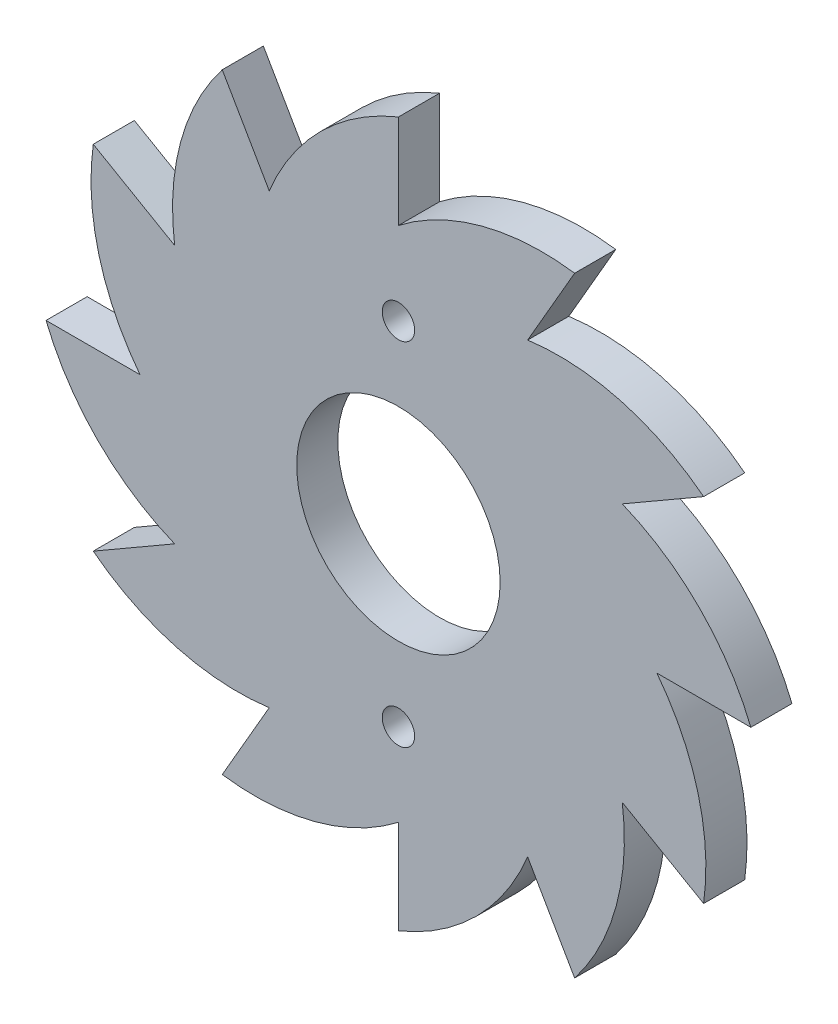
ISO-10303-21;
HEADER;
FILE_DESCRIPTION(('STEP AP214'),'2;1');
FILE_NAME('part.step','',(''),(''),'','','');
FILE_SCHEMA(('AUTOMOTIVE_DESIGN { 1 0 10303 214 1 1 1 1 }'));
ENDSEC;
DATA;
#1=APPLICATION_CONTEXT('core data for automotive mechanical design processes');
#2=APPLICATION_PROTOCOL_DEFINITION('international standard','automotive_design',2000,#1);
#3=PRODUCT_CONTEXT('',#1,'mechanical');
#4=PRODUCT('Part','Part','',(#3));
#5=PRODUCT_RELATED_PRODUCT_CATEGORY('part','',(#4));
#6=PRODUCT_DEFINITION_FORMATION('','',#4);
#7=PRODUCT_DEFINITION_CONTEXT('part definition',#1,'design');
#8=PRODUCT_DEFINITION('design','',#6,#7);
#9=PRODUCT_DEFINITION_SHAPE('','',#8);
#10=(LENGTH_UNIT() NAMED_UNIT(*) SI_UNIT(.MILLI.,.METRE.));
#11=(NAMED_UNIT(*) PLANE_ANGLE_UNIT() SI_UNIT($,.RADIAN.));
#12=(NAMED_UNIT(*) SI_UNIT($,.STERADIAN.) SOLID_ANGLE_UNIT());
#13=UNCERTAINTY_MEASURE_WITH_UNIT(LENGTH_MEASURE(1.E-05),#10,'distance_accuracy_value','');
#14=(GEOMETRIC_REPRESENTATION_CONTEXT(3) GLOBAL_UNCERTAINTY_ASSIGNED_CONTEXT((#13)) GLOBAL_UNIT_ASSIGNED_CONTEXT((#10,
#11,#12)) REPRESENTATION_CONTEXT('',''));
#15=CARTESIAN_POINT('',(0.,0.,0.));
#16=DIRECTION('',(0.,0.,1.));
#17=DIRECTION('',(1.,0.,0.));
#18=AXIS2_PLACEMENT_3D('',#15,#16,#17);
#19=CARTESIAN_POINT('',(0.,0.,4.445));
#20=DIRECTION('',(0.,0.,1.));
#21=DIRECTION('',(1.,0.,0.));
#22=AXIS2_PLACEMENT_3D('',#19,#20,#21);
#23=PLANE('',#22);
#24=CARTESIAN_POINT('',(0.,0.,4.445));
#25=DIRECTION('',(0.,0.,1.));
#26=DIRECTION('',(1.,0.,0.));
#27=AXIS2_PLACEMENT_3D('',#24,#25,#26);
#28=CIRCLE('',#27,10.9982);
#29=CARTESIAN_POINT('',(10.9982,0.,4.445));
#30=VERTEX_POINT('',#29);
#31=EDGE_CURVE('E240',#30,#30,#28,.T.);
#32=ORIENTED_EDGE('',*,*,#31,.F.);
#33=EDGE_LOOP('',(#32));
#34=FACE_BOUND('',#33,.T.);
#35=CARTESIAN_POINT('',(0.,18.9992,4.445));
#36=DIRECTION('',(0.,0.,1.));
#37=DIRECTION('',(1.,0.,0.));
#38=AXIS2_PLACEMENT_3D('',#35,#36,#37);
#39=CIRCLE('',#38,1.7526);
#40=CARTESIAN_POINT('',(1.7526,18.9992,4.445));
#41=VERTEX_POINT('',#40);
#42=EDGE_CURVE('E11',#41,#41,#39,.T.);
#43=ORIENTED_EDGE('',*,*,#42,.F.);
#44=EDGE_LOOP('',(#43));
#45=FACE_BOUND('',#44,.T.);
#46=CARTESIAN_POINT('',(0.,-18.9992,4.445));
#47=DIRECTION('',(0.,0.,1.));
#48=DIRECTION('',(1.,0.,0.));
#49=AXIS2_PLACEMENT_3D('',#46,#47,#48);
#50=CIRCLE('',#49,1.7526);
#51=CARTESIAN_POINT('',(1.7526,-18.9992,4.445));
#52=VERTEX_POINT('',#51);
#53=EDGE_CURVE('E234',#52,#52,#50,.T.);
#54=ORIENTED_EDGE('',*,*,#53,.F.);
#55=EDGE_LOOP('',(#54));
#56=FACE_BOUND('',#55,.T.);
#57=CARTESIAN_POINT('',(15.5298763611878,7.84067314047041,4.445));
#58=DIRECTION('',(0.,0.,1.));
#59=DIRECTION('',(0.866025403784445,-0.499999999999989,0.));
#60=AXIS2_PLACEMENT_3D('',#57,#58,#59);
#61=CIRCLE('',#60,25.4);
#62=CARTESIAN_POINT('',(-4.00721122950642E-13,27.94,4.445));
#63=VERTEX_POINT('',#62);
#64=CARTESIAN_POINT('',(19.0499999999996,32.9955678841874,4.445));
#65=VERTEX_POINT('',#64);
#66=EDGE_CURVE('E218',#63,#65,#61,.F.);
#67=ORIENTED_EDGE('',*,*,#66,.F.);
#68=DIRECTION('',(0.,1.,0.));
#69=VECTOR('',#68,1.);
#70=CARTESIAN_POINT('',(0.,0.,4.445));
#71=LINE('',#70,#69);
#72=CARTESIAN_POINT('',(-5.51642065360625E-13,38.1,4.445));
#73=VERTEX_POINT('',#72);
#74=EDGE_CURVE('E207',#63,#73,#71,.T.);
#75=ORIENTED_EDGE('',*,*,#74,.T.);
#76=CARTESIAN_POINT('',(9.52893087618506,14.5551603030115,4.445));
#77=DIRECTION('',(0.,0.,1.));
#78=DIRECTION('',(1.,0.,0.));
#79=AXIS2_PLACEMENT_3D('',#76,#77,#78);
#80=CIRCLE('',#79,25.4);
#81=CARTESIAN_POINT('',(-13.97,24.1967497817372,4.445));
#82=VERTEX_POINT('',#81);
#83=EDGE_CURVE('E216',#82,#73,#80,.F.);
#84=ORIENTED_EDGE('',*,*,#83,.F.);
#85=DIRECTION('',(-0.500000000000001,0.866025403784438,0.));
#86=VECTOR('',#85,1.);
#87=CARTESIAN_POINT('',(0.,0.,4.445));
#88=LINE('',#87,#86);
#89=CARTESIAN_POINT('',(-19.0500000000001,32.9955678841871,4.445));
#90=VERTEX_POINT('',#89);
#91=EDGE_CURVE('E223',#82,#90,#88,.T.);
#92=ORIENTED_EDGE('',*,*,#91,.T.);
#93=CARTESIAN_POINT('',(0.974716058176415,17.3696040166553,4.445));
#94=DIRECTION('',(0.,0.,1.));
#95=DIRECTION('',(0.866025403784438,0.500000000000001,0.));
#96=AXIS2_PLACEMENT_3D('',#93,#94,#95);
#97=CIRCLE('',#96,25.4);
#98=CARTESIAN_POINT('',(-24.1967497817373,13.9699999999999,4.445));
#99=VERTEX_POINT('',#98);
#100=EDGE_CURVE('E432',#99,#90,#97,.F.);
#101=ORIENTED_EDGE('',*,*,#100,.F.);
#102=DIRECTION('',(-0.86602540378444,0.499999999999998,0.));
#103=VECTOR('',#102,1.);
#104=CARTESIAN_POINT('',(0.,0.,4.445));
#105=LINE('',#104,#103);
#106=CARTESIAN_POINT('',(-32.9955678841872,19.0499999999999,4.445));
#107=VERTEX_POINT('',#106);
#108=EDGE_CURVE('E421',#99,#107,#105,.T.);
#109=ORIENTED_EDGE('',*,*,#108,.T.);
#110=CARTESIAN_POINT('',(-7.84067314047025,15.5298763611879,4.445));
#111=DIRECTION('',(0.,0.,1.));
#112=DIRECTION('',(0.499999999999998,0.86602540378444,0.));
#113=AXIS2_PLACEMENT_3D('',#110,#111,#112);
#114=CIRCLE('',#113,25.4);
#115=CARTESIAN_POINT('',(-27.94,-1.07552855510562E-13,4.445));
#116=VERTEX_POINT('',#115);
#117=EDGE_CURVE('E419',#116,#107,#114,.F.);
#118=ORIENTED_EDGE('',*,*,#117,.F.);
#119=DIRECTION('',(-1.,0.,0.));
#120=VECTOR('',#119,1.);
#121=CARTESIAN_POINT('',(0.,0.,4.445));
#122=LINE('',#121,#120);
#123=CARTESIAN_POINT('',(-38.1,-1.49186218934005E-13,4.445));
#124=VERTEX_POINT('',#123);
#125=EDGE_CURVE('E406',#116,#124,#122,.T.);
#126=ORIENTED_EDGE('',*,*,#125,.T.);
#127=CARTESIAN_POINT('',(-14.5551603030115,9.52893087618501,4.445));
#128=DIRECTION('',(0.,0.,1.));
#129=DIRECTION('',(0.,1.,0.));
#130=AXIS2_PLACEMENT_3D('',#127,#128,#129);
#131=CIRCLE('',#130,25.4);
#132=CARTESIAN_POINT('',(-24.1967497817372,-13.9700000000001,4.445));
#133=VERTEX_POINT('',#132);
#134=EDGE_CURVE('E404',#133,#124,#131,.F.);
#135=ORIENTED_EDGE('',*,*,#134,.F.);
#136=DIRECTION('',(-0.866025403784436,-0.500000000000004,0.));
#137=VECTOR('',#136,1.);
#138=CARTESIAN_POINT('',(0.,0.,4.445));
#139=LINE('',#138,#137);
#140=CARTESIAN_POINT('',(-32.995567884187,-19.0500000000002,4.445));
#141=VERTEX_POINT('',#140);
#142=EDGE_CURVE('E390',#133,#141,#139,.T.);
#143=ORIENTED_EDGE('',*,*,#142,.T.);
#144=CARTESIAN_POINT('',(-17.3696040166553,0.974716058176354,4.445));
#145=DIRECTION('',(0.,0.,1.));
#146=DIRECTION('',(-0.500000000000004,0.866025403784436,0.));
#147=AXIS2_PLACEMENT_3D('',#144,#145,#146);
#148=CIRCLE('',#147,25.4);
#149=CARTESIAN_POINT('',(-13.9699999999999,-24.1967497817373,4.445));
#150=VERTEX_POINT('',#149);
#151=EDGE_CURVE('E388',#150,#141,#148,.F.);
#152=ORIENTED_EDGE('',*,*,#151,.F.);
#153=DIRECTION('',(-0.499999999999995,-0.866025403784442,0.));
#154=VECTOR('',#153,1.);
#155=CARTESIAN_POINT('',(0.,0.,4.445));
#156=LINE('',#155,#154);
#157=CARTESIAN_POINT('',(-19.0499999999998,-32.9955678841872,4.445));
#158=VERTEX_POINT('',#157);
#159=EDGE_CURVE('E374',#150,#158,#156,.T.);
#160=ORIENTED_EDGE('',*,*,#159,.T.);
#161=CARTESIAN_POINT('',(-15.5298763611879,-7.8406731404703,4.445));
#162=DIRECTION('',(0.,0.,1.));
#163=DIRECTION('',(-0.866025403784442,0.499999999999995,0.));
#164=AXIS2_PLACEMENT_3D('',#161,#162,#163);
#165=CIRCLE('',#164,25.4);
#166=CARTESIAN_POINT('',(2.04697370165263E-13,-27.94,4.445));
#167=VERTEX_POINT('',#166);
#168=EDGE_CURVE('E372',#167,#158,#165,.F.);
#169=ORIENTED_EDGE('',*,*,#168,.F.);
#170=DIRECTION('',(0.,-1.,0.));
#171=VECTOR('',#170,1.);
#172=CARTESIAN_POINT('',(0.,0.,4.445));
#173=LINE('',#172,#171);
#174=CARTESIAN_POINT('',(2.84494650060196E-13,-38.1,4.445));
#175=VERTEX_POINT('',#174);
#176=EDGE_CURVE('E358',#167,#175,#173,.T.);
#177=ORIENTED_EDGE('',*,*,#176,.T.);
#178=CARTESIAN_POINT('',(-9.52893087618506,-14.5551603030115,4.445));
#179=DIRECTION('',(0.,0.,1.));
#180=DIRECTION('',(-1.,0.,0.));
#181=AXIS2_PLACEMENT_3D('',#178,#179,#180);
#182=CIRCLE('',#181,25.4);
#183=CARTESIAN_POINT('',(13.97,-24.1967497817372,4.445));
#184=VERTEX_POINT('',#183);
#185=EDGE_CURVE('E356',#184,#175,#182,.F.);
#186=ORIENTED_EDGE('',*,*,#185,.F.);
#187=DIRECTION('',(0.500000000000001,-0.866025403784438,0.));
#188=VECTOR('',#187,1.);
#189=CARTESIAN_POINT('',(0.,0.,4.445));
#190=LINE('',#189,#188);
#191=CARTESIAN_POINT('',(19.0500000000001,-32.9955678841871,4.445));
#192=VERTEX_POINT('',#191);
#193=EDGE_CURVE('E342',#184,#192,#190,.T.);
#194=ORIENTED_EDGE('',*,*,#193,.T.);
#195=CARTESIAN_POINT('',(-0.974716058176293,-17.3696040166553,4.445));
#196=DIRECTION('',(0.,0.,1.));
#197=DIRECTION('',(-0.866025403784435,-0.500000000000007,0.));
#198=AXIS2_PLACEMENT_3D('',#195,#196,#197);
#199=CIRCLE('',#198,25.4);
#200=CARTESIAN_POINT('',(24.1967497817374,-13.9699999999998,4.445));
#201=VERTEX_POINT('',#200);
#202=EDGE_CURVE('E340',#201,#192,#199,.F.);
#203=ORIENTED_EDGE('',*,*,#202,.F.);
#204=DIRECTION('',(0.866025403784444,-0.499999999999992,0.));
#205=VECTOR('',#204,1.);
#206=CARTESIAN_POINT('',(0.,0.,4.445));
#207=LINE('',#206,#205);
#208=CARTESIAN_POINT('',(32.9955678841873,-19.0499999999997,4.445));
#209=VERTEX_POINT('',#208);
#210=EDGE_CURVE('E326',#201,#209,#207,.T.);
#211=ORIENTED_EDGE('',*,*,#210,.T.);
#212=CARTESIAN_POINT('',(7.84067314047035,-15.5298763611878,4.445));
#213=DIRECTION('',(0.,0.,1.));
#214=DIRECTION('',(-0.499999999999992,-0.866025403784443,0.));
#215=AXIS2_PLACEMENT_3D('',#212,#213,#214);
#216=CIRCLE('',#215,25.4);
#217=CARTESIAN_POINT('',(27.94,3.01841884819964E-13,4.445));
#218=VERTEX_POINT('',#217);
#219=EDGE_CURVE('E324',#218,#209,#216,.F.);
#220=ORIENTED_EDGE('',*,*,#219,.F.);
#221=DIRECTION('',(1.,0.,0.));
#222=VECTOR('',#221,1.);
#223=CARTESIAN_POINT('',(0.,0.,4.445));
#224=LINE('',#223,#222);
#225=CARTESIAN_POINT('',(38.1,4.16333634234434E-13,4.445));
#226=VERTEX_POINT('',#225);
#227=EDGE_CURVE('E310',#218,#226,#224,.T.);
#228=ORIENTED_EDGE('',*,*,#227,.T.);
#229=CARTESIAN_POINT('',(14.5551603030116,-9.5289308761849,4.445));
#230=DIRECTION('',(0.,0.,1.));
#231=DIRECTION('',(0.,-1.,0.));
#232=AXIS2_PLACEMENT_3D('',#229,#230,#231);
#233=CIRCLE('',#232,25.4);
#234=CARTESIAN_POINT('',(24.1967497817371,13.9700000000003,4.445));
#235=VERTEX_POINT('',#234);
#236=EDGE_CURVE('E308',#235,#226,#233,.F.);
#237=ORIENTED_EDGE('',*,*,#236,.F.);
#238=DIRECTION('',(0.866025403784433,0.500000000000011,0.));
#239=VECTOR('',#238,1.);
#240=CARTESIAN_POINT('',(0.,0.,4.445));
#241=LINE('',#240,#239);
#242=CARTESIAN_POINT('',(32.9955678841869,19.0500000000004,4.445));
#243=VERTEX_POINT('',#242);
#244=EDGE_CURVE('E296',#235,#243,#241,.T.);
#245=ORIENTED_EDGE('',*,*,#244,.T.);
#246=CARTESIAN_POINT('',(17.3696040166553,-0.974716058176232,4.445));
#247=DIRECTION('',(0.,0.,1.));
#248=DIRECTION('',(0.50000000000001,-0.866025403784433,0.));
#249=AXIS2_PLACEMENT_3D('',#246,#247,#248);
#250=CIRCLE('',#249,25.4);
#251=CARTESIAN_POINT('',(13.9699999999997,24.1967497817374,4.445));
#252=VERTEX_POINT('',#251);
#253=EDGE_CURVE('E294',#252,#243,#250,.F.);
#254=ORIENTED_EDGE('',*,*,#253,.F.);
#255=DIRECTION('',(0.499999999999989,0.866025403784445,0.));
#256=VECTOR('',#255,1.);
#257=CARTESIAN_POINT('',(0.,0.,4.445));
#258=LINE('',#257,#256);
#259=EDGE_CURVE('E284',#252,#65,#258,.T.);
#260=ORIENTED_EDGE('',*,*,#259,.T.);
#261=EDGE_LOOP('',(#67,#75,#84,#92,#101,#109,#118,#126,#135,#143,#152,#160,#169,#177,#186,#194,
#203,#211,#220,#228,#237,#245,#254,#260));
#262=FACE_BOUND('',#261,.T.);
#263=ADVANCED_FACE('F32',(#34,#45,#56,#262),#23,.T.);
#264=CARTESIAN_POINT('',(0.,0.,0.));
#265=DIRECTION('',(0.,0.,1.));
#266=DIRECTION('',(1.,0.,0.));
#267=AXIS2_PLACEMENT_3D('',#264,#265,#266);
#268=PLANE('',#267);
#269=CARTESIAN_POINT('',(0.,0.,0.));
#270=DIRECTION('',(0.,0.,1.));
#271=DIRECTION('',(1.,0.,0.));
#272=AXIS2_PLACEMENT_3D('',#269,#270,#271);
#273=CIRCLE('',#272,10.9982);
#274=CARTESIAN_POINT('',(10.9982,0.,0.));
#275=VERTEX_POINT('',#274);
#276=EDGE_CURVE('E237',#275,#275,#273,.T.);
#277=ORIENTED_EDGE('',*,*,#276,.T.);
#278=EDGE_LOOP('',(#277));
#279=FACE_BOUND('',#278,.T.);
#280=CARTESIAN_POINT('',(0.,18.9992,0.));
#281=DIRECTION('',(0.,0.,1.));
#282=DIRECTION('',(1.,0.,0.));
#283=AXIS2_PLACEMENT_3D('',#280,#281,#282);
#284=CIRCLE('',#283,1.7526);
#285=CARTESIAN_POINT('',(1.7526,18.9992,0.));
#286=VERTEX_POINT('',#285);
#287=EDGE_CURVE('E36',#286,#286,#284,.T.);
#288=ORIENTED_EDGE('',*,*,#287,.T.);
#289=EDGE_LOOP('',(#288));
#290=FACE_BOUND('',#289,.T.);
#291=CARTESIAN_POINT('',(0.,-18.9992,0.));
#292=DIRECTION('',(0.,0.,1.));
#293=DIRECTION('',(1.,0.,0.));
#294=AXIS2_PLACEMENT_3D('',#291,#292,#293);
#295=CIRCLE('',#294,1.7526);
#296=CARTESIAN_POINT('',(1.7526,-18.9992,0.));
#297=VERTEX_POINT('',#296);
#298=EDGE_CURVE('E231',#297,#297,#295,.T.);
#299=ORIENTED_EDGE('',*,*,#298,.T.);
#300=EDGE_LOOP('',(#299));
#301=FACE_BOUND('',#300,.T.);
#302=DIRECTION('',(0.,1.,0.));
#303=VECTOR('',#302,1.);
#304=CARTESIAN_POINT('',(0.,0.,0.));
#305=LINE('',#304,#303);
#306=CARTESIAN_POINT('',(-4.00721122950642E-13,27.94,0.));
#307=VERTEX_POINT('',#306);
#308=CARTESIAN_POINT('',(-5.51642065360625E-13,38.1,0.));
#309=VERTEX_POINT('',#308);
#310=EDGE_CURVE('E210',#307,#309,#305,.T.);
#311=ORIENTED_EDGE('',*,*,#310,.F.);
#312=CARTESIAN_POINT('',(15.5298763611878,7.84067314047041,0.));
#313=DIRECTION('',(0.,0.,1.));
#314=DIRECTION('',(0.866025403784445,-0.499999999999989,0.));
#315=AXIS2_PLACEMENT_3D('',#312,#313,#314);
#316=CIRCLE('',#315,25.4);
#317=CARTESIAN_POINT('',(19.0499999999996,32.9955678841874,0.));
#318=VERTEX_POINT('',#317);
#319=EDGE_CURVE('E280',#307,#318,#316,.F.);
#320=ORIENTED_EDGE('',*,*,#319,.T.);
#321=DIRECTION('',(0.499999999999989,0.866025403784445,0.));
#322=VECTOR('',#321,1.);
#323=CARTESIAN_POINT('',(0.,0.,0.));
#324=LINE('',#323,#322);
#325=CARTESIAN_POINT('',(13.9699999999997,24.1967497817374,0.));
#326=VERTEX_POINT('',#325);
#327=EDGE_CURVE('E297',#326,#318,#324,.T.);
#328=ORIENTED_EDGE('',*,*,#327,.F.);
#329=CARTESIAN_POINT('',(17.3696040166553,-0.974716058176232,0.));
#330=DIRECTION('',(0.,0.,1.));
#331=DIRECTION('',(0.50000000000001,-0.866025403784433,0.));
#332=AXIS2_PLACEMENT_3D('',#329,#330,#331);
#333=CIRCLE('',#332,25.4);
#334=CARTESIAN_POINT('',(32.9955678841869,19.0500000000004,0.));
#335=VERTEX_POINT('',#334);
#336=EDGE_CURVE('E293',#326,#335,#333,.F.);
#337=ORIENTED_EDGE('',*,*,#336,.T.);
#338=DIRECTION('',(0.866025403784433,0.500000000000011,0.));
#339=VECTOR('',#338,1.);
#340=CARTESIAN_POINT('',(0.,0.,0.));
#341=LINE('',#340,#339);
#342=CARTESIAN_POINT('',(24.1967497817371,13.9700000000003,0.));
#343=VERTEX_POINT('',#342);
#344=EDGE_CURVE('E311',#343,#335,#341,.T.);
#345=ORIENTED_EDGE('',*,*,#344,.F.);
#346=CARTESIAN_POINT('',(14.5551603030116,-9.5289308761849,0.));
#347=DIRECTION('',(0.,0.,1.));
#348=DIRECTION('',(0.,-1.,0.));
#349=AXIS2_PLACEMENT_3D('',#346,#347,#348);
#350=CIRCLE('',#349,25.4);
#351=CARTESIAN_POINT('',(38.1,3.9907631702977E-13,0.));
#352=VERTEX_POINT('',#351);
#353=EDGE_CURVE('E307',#343,#352,#350,.F.);
#354=ORIENTED_EDGE('',*,*,#353,.T.);
#355=DIRECTION('',(1.,0.,0.));
#356=VECTOR('',#355,1.);
#357=CARTESIAN_POINT('',(0.,0.,0.));
#358=LINE('',#357,#356);
#359=CARTESIAN_POINT('',(27.94,3.01841884819964E-13,0.));
#360=VERTEX_POINT('',#359);
#361=EDGE_CURVE('E327',#360,#352,#358,.T.);
#362=ORIENTED_EDGE('',*,*,#361,.F.);
#363=CARTESIAN_POINT('',(7.84067314047035,-15.5298763611878,0.));
#364=DIRECTION('',(0.,0.,1.));
#365=DIRECTION('',(-0.499999999999992,-0.866025403784443,0.));
#366=AXIS2_PLACEMENT_3D('',#363,#364,#365);
#367=CIRCLE('',#366,25.4);
#368=CARTESIAN_POINT('',(32.9955678841873,-19.0499999999997,0.));
#369=VERTEX_POINT('',#368);
#370=EDGE_CURVE('E323',#360,#369,#367,.F.);
#371=ORIENTED_EDGE('',*,*,#370,.T.);
#372=DIRECTION('',(0.866025403784444,-0.499999999999992,0.));
#373=VECTOR('',#372,1.);
#374=CARTESIAN_POINT('',(0.,0.,0.));
#375=LINE('',#374,#373);
#376=CARTESIAN_POINT('',(24.1967497817374,-13.9699999999998,0.));
#377=VERTEX_POINT('',#376);
#378=EDGE_CURVE('E343',#377,#369,#375,.T.);
#379=ORIENTED_EDGE('',*,*,#378,.F.);
#380=CARTESIAN_POINT('',(-0.974716058176293,-17.3696040166553,0.));
#381=DIRECTION('',(0.,0.,1.));
#382=DIRECTION('',(-0.866025403784435,-0.500000000000007,0.));
#383=AXIS2_PLACEMENT_3D('',#380,#381,#382);
#384=CIRCLE('',#383,25.4);
#385=CARTESIAN_POINT('',(19.0500000000003,-32.995567884187,0.));
#386=VERTEX_POINT('',#385);
#387=EDGE_CURVE('E339',#377,#386,#384,.F.);
#388=ORIENTED_EDGE('',*,*,#387,.T.);
#389=DIRECTION('',(0.500000000000001,-0.866025403784438,0.));
#390=VECTOR('',#389,1.);
#391=CARTESIAN_POINT('',(0.,0.,0.));
#392=LINE('',#391,#390);
#393=CARTESIAN_POINT('',(13.97,-24.1967497817372,0.));
#394=VERTEX_POINT('',#393);
#395=EDGE_CURVE('E359',#394,#386,#392,.T.);
#396=ORIENTED_EDGE('',*,*,#395,.F.);
#397=CARTESIAN_POINT('',(-9.52893087618506,-14.5551603030115,0.));
#398=DIRECTION('',(0.,0.,1.));
#399=DIRECTION('',(-1.,0.,0.));
#400=AXIS2_PLACEMENT_3D('',#397,#398,#399);
#401=CIRCLE('',#400,25.4);
#402=CARTESIAN_POINT('',(0.,-38.1,0.));
#403=VERTEX_POINT('',#402);
#404=EDGE_CURVE('E355',#394,#403,#401,.F.);
#405=ORIENTED_EDGE('',*,*,#404,.T.);
#406=DIRECTION('',(0.,-1.,0.));
#407=VECTOR('',#406,1.);
#408=CARTESIAN_POINT('',(0.,0.,0.));
#409=LINE('',#408,#407);
#410=CARTESIAN_POINT('',(2.04697370165263E-13,-27.94,0.));
#411=VERTEX_POINT('',#410);
#412=EDGE_CURVE('E375',#411,#403,#409,.T.);
#413=ORIENTED_EDGE('',*,*,#412,.F.);
#414=CARTESIAN_POINT('',(-15.5298763611879,-7.8406731404703,0.));
#415=DIRECTION('',(0.,0.,1.));
#416=DIRECTION('',(-0.866025403784442,0.499999999999995,0.));
#417=AXIS2_PLACEMENT_3D('',#414,#415,#416);
#418=CIRCLE('',#417,25.4);
#419=CARTESIAN_POINT('',(-19.0499999999998,-32.9955678841872,0.));
#420=VERTEX_POINT('',#419);
#421=EDGE_CURVE('E371',#411,#420,#418,.F.);
#422=ORIENTED_EDGE('',*,*,#421,.T.);
#423=DIRECTION('',(-0.499999999999995,-0.866025403784442,0.));
#424=VECTOR('',#423,1.);
#425=CARTESIAN_POINT('',(0.,0.,0.));
#426=LINE('',#425,#424);
#427=CARTESIAN_POINT('',(-13.9699999999999,-24.1967497817373,0.));
#428=VERTEX_POINT('',#427);
#429=EDGE_CURVE('E391',#428,#420,#426,.T.);
#430=ORIENTED_EDGE('',*,*,#429,.F.);
#431=CARTESIAN_POINT('',(-17.3696040166553,0.974716058176354,0.));
#432=DIRECTION('',(0.,0.,1.));
#433=DIRECTION('',(-0.500000000000004,0.866025403784436,0.));
#434=AXIS2_PLACEMENT_3D('',#431,#432,#433);
#435=CIRCLE('',#434,25.4);
#436=CARTESIAN_POINT('',(-32.995567884187,-19.0500000000002,0.));
#437=VERTEX_POINT('',#436);
#438=EDGE_CURVE('E387',#428,#437,#435,.F.);
#439=ORIENTED_EDGE('',*,*,#438,.T.);
#440=DIRECTION('',(-0.866025403784436,-0.500000000000004,0.));
#441=VECTOR('',#440,1.);
#442=CARTESIAN_POINT('',(0.,0.,0.));
#443=LINE('',#442,#441);
#444=CARTESIAN_POINT('',(-24.1967497817372,-13.9700000000001,0.));
#445=VERTEX_POINT('',#444);
#446=EDGE_CURVE('E407',#445,#437,#443,.T.);
#447=ORIENTED_EDGE('',*,*,#446,.F.);
#448=CARTESIAN_POINT('',(-14.5551603030115,9.52893087618501,0.));
#449=DIRECTION('',(0.,0.,1.));
#450=DIRECTION('',(0.,1.,0.));
#451=AXIS2_PLACEMENT_3D('',#448,#449,#450);
#452=CIRCLE('',#451,25.4);
#453=CARTESIAN_POINT('',(-38.1,-1.33025439009923E-13,0.));
#454=VERTEX_POINT('',#453);
#455=EDGE_CURVE('E403',#445,#454,#452,.F.);
#456=ORIENTED_EDGE('',*,*,#455,.T.);
#457=DIRECTION('',(-1.,0.,0.));
#458=VECTOR('',#457,1.);
#459=CARTESIAN_POINT('',(0.,0.,0.));
#460=LINE('',#459,#458);
#461=CARTESIAN_POINT('',(-27.94,-1.07552855510562E-13,0.));
#462=VERTEX_POINT('',#461);
#463=EDGE_CURVE('E422',#462,#454,#460,.T.);
#464=ORIENTED_EDGE('',*,*,#463,.F.);
#465=CARTESIAN_POINT('',(-7.84067314047025,15.5298763611879,0.));
#466=DIRECTION('',(0.,0.,1.));
#467=DIRECTION('',(0.499999999999998,0.86602540378444,0.));
#468=AXIS2_PLACEMENT_3D('',#465,#466,#467);
#469=CIRCLE('',#468,25.4);
#470=CARTESIAN_POINT('',(-32.9955678841872,19.0499999999999,0.));
#471=VERTEX_POINT('',#470);
#472=EDGE_CURVE('E418',#462,#471,#469,.F.);
#473=ORIENTED_EDGE('',*,*,#472,.T.);
#474=DIRECTION('',(-0.86602540378444,0.499999999999998,0.));
#475=VECTOR('',#474,1.);
#476=CARTESIAN_POINT('',(0.,0.,0.));
#477=LINE('',#476,#475);
#478=CARTESIAN_POINT('',(-24.1967497817373,13.9699999999999,0.));
#479=VERTEX_POINT('',#478);
#480=EDGE_CURVE('E428',#479,#471,#477,.T.);
#481=ORIENTED_EDGE('',*,*,#480,.F.);
#482=CARTESIAN_POINT('',(0.974716058176415,17.3696040166553,0.));
#483=DIRECTION('',(0.,0.,1.));
#484=DIRECTION('',(0.866025403784438,0.500000000000001,0.));
#485=AXIS2_PLACEMENT_3D('',#482,#483,#484);
#486=CIRCLE('',#485,25.4);
#487=CARTESIAN_POINT('',(-19.05,32.9955678841871,0.));
#488=VERTEX_POINT('',#487);
#489=EDGE_CURVE('E431',#479,#488,#486,.F.);
#490=ORIENTED_EDGE('',*,*,#489,.T.);
#491=DIRECTION('',(-0.500000000000001,0.866025403784438,0.));
#492=VECTOR('',#491,1.);
#493=CARTESIAN_POINT('',(0.,0.,0.));
#494=LINE('',#493,#492);
#495=CARTESIAN_POINT('',(-13.97,24.1967497817372,0.));
#496=VERTEX_POINT('',#495);
#497=EDGE_CURVE('E222',#496,#488,#494,.T.);
#498=ORIENTED_EDGE('',*,*,#497,.F.);
#499=CARTESIAN_POINT('',(9.52893087618506,14.5551603030115,0.));
#500=DIRECTION('',(0.,0.,1.));
#501=DIRECTION('',(1.,0.,0.));
#502=AXIS2_PLACEMENT_3D('',#499,#500,#501);
#503=CIRCLE('',#502,25.4);
#504=EDGE_CURVE('E225',#496,#309,#503,.F.);
#505=ORIENTED_EDGE('',*,*,#504,.T.);
#506=EDGE_LOOP('',(#311,#320,#328,#337,#345,#354,#362,#371,#379,#388,#396,#405,#413,#422,#430,
#439,#447,#456,#464,#473,#481,#490,#498,#505));
#507=FACE_BOUND('',#506,.T.);
#508=ADVANCED_FACE('F34',(#279,#290,#301,#507),#268,.F.);
#509=CARTESIAN_POINT('',(0.,18.9992,4.445));
#510=DIRECTION('',(0.,0.,-1.));
#511=DIRECTION('',(-1.,0.,0.));
#512=AXIS2_PLACEMENT_3D('',#509,#510,#511);
#513=CYLINDRICAL_SURFACE('',#512,1.7526);
#514=ORIENTED_EDGE('',*,*,#42,.T.);
#515=EDGE_LOOP('',(#514));
#516=FACE_BOUND('',#515,.T.);
#517=ORIENTED_EDGE('',*,*,#287,.F.);
#518=EDGE_LOOP('',(#517));
#519=FACE_BOUND('',#518,.T.);
#520=ADVANCED_FACE('F251',(#516,#519),#513,.F.);
#521=CARTESIAN_POINT('',(0.,0.,4.445));
#522=DIRECTION('',(0.,0.,-1.));
#523=DIRECTION('',(-1.,0.,0.));
#524=AXIS2_PLACEMENT_3D('',#521,#522,#523);
#525=CYLINDRICAL_SURFACE('',#524,10.9982);
#526=ORIENTED_EDGE('',*,*,#31,.T.);
#527=EDGE_LOOP('',(#526));
#528=FACE_BOUND('',#527,.T.);
#529=ORIENTED_EDGE('',*,*,#276,.F.);
#530=EDGE_LOOP('',(#529));
#531=FACE_BOUND('',#530,.T.);
#532=ADVANCED_FACE('F248',(#528,#531),#525,.F.);
#533=CARTESIAN_POINT('',(0.,-18.9992,4.445));
#534=DIRECTION('',(0.,0.,-1.));
#535=DIRECTION('',(-1.,0.,0.));
#536=AXIS2_PLACEMENT_3D('',#533,#534,#535);
#537=CYLINDRICAL_SURFACE('',#536,1.7526);
#538=ORIENTED_EDGE('',*,*,#53,.T.);
#539=EDGE_LOOP('',(#538));
#540=FACE_BOUND('',#539,.T.);
#541=ORIENTED_EDGE('',*,*,#298,.F.);
#542=EDGE_LOOP('',(#541));
#543=FACE_BOUND('',#542,.T.);
#544=ADVANCED_FACE('F250',(#540,#543),#537,.F.);
#545=CARTESIAN_POINT('',(0.,0.,0.));
#546=DIRECTION('',(0.866025403784438,0.500000000000001,0.));
#547=DIRECTION('',(-0.500000000000001,0.866025403784438,0.));
#548=AXIS2_PLACEMENT_3D('',#545,#546,#547);
#549=PLANE('',#548);
#550=ORIENTED_EDGE('',*,*,#91,.F.);
#551=DIRECTION('',(0.,0.,1.));
#552=VECTOR('',#551,1.);
#553=CARTESIAN_POINT('',(-13.97,24.1967497817372,0.));
#554=LINE('',#553,#552);
#555=EDGE_CURVE('E48',#496,#82,#554,.T.);
#556=ORIENTED_EDGE('',*,*,#555,.F.);
#557=ORIENTED_EDGE('',*,*,#497,.T.);
#558=DIRECTION('',(0.,0.,1.));
#559=VECTOR('',#558,1.);
#560=CARTESIAN_POINT('',(-19.0500000000001,32.9955678841871,0.));
#561=LINE('',#560,#559);
#562=EDGE_CURVE('E64',#488,#90,#561,.T.);
#563=ORIENTED_EDGE('',*,*,#562,.T.);
#564=EDGE_LOOP('',(#550,#556,#557,#563));
#565=FACE_BOUND('',#564,.T.);
#566=ADVANCED_FACE('F258',(#565),#549,.T.);
#567=CARTESIAN_POINT('',(9.52893087618506,14.5551603030115,0.));
#568=DIRECTION('',(0.,0.,1.));
#569=DIRECTION('',(1.,0.,0.));
#570=AXIS2_PLACEMENT_3D('',#567,#568,#569);
#571=CYLINDRICAL_SURFACE('',#570,25.4);
#572=ORIENTED_EDGE('',*,*,#83,.T.);
#573=DIRECTION('',(0.,0.,1.));
#574=VECTOR('',#573,1.);
#575=CARTESIAN_POINT('',(0.,38.1,0.));
#576=LINE('',#575,#574);
#577=EDGE_CURVE('E204',#309,#73,#576,.T.);
#578=ORIENTED_EDGE('',*,*,#577,.F.);
#579=ORIENTED_EDGE('',*,*,#504,.F.);
#580=ORIENTED_EDGE('',*,*,#555,.T.);
#581=EDGE_LOOP('',(#572,#578,#579,#580));
#582=FACE_BOUND('',#581,.T.);
#583=ADVANCED_FACE('F221',(#582),#571,.T.);
#584=CARTESIAN_POINT('',(0.,0.,0.));
#585=DIRECTION('',(0.499999999999998,0.86602540378444,0.));
#586=DIRECTION('',(-0.86602540378444,0.499999999999998,0.));
#587=AXIS2_PLACEMENT_3D('',#584,#585,#586);
#588=PLANE('',#587);
#589=ORIENTED_EDGE('',*,*,#108,.F.);
#590=DIRECTION('',(0.,0.,1.));
#591=VECTOR('',#590,1.);
#592=CARTESIAN_POINT('',(-24.1967497817373,13.9699999999999,0.));
#593=LINE('',#592,#591);
#594=EDGE_CURVE('E72',#479,#99,#593,.T.);
#595=ORIENTED_EDGE('',*,*,#594,.F.);
#596=ORIENTED_EDGE('',*,*,#480,.T.);
#597=DIRECTION('',(0.,0.,1.));
#598=VECTOR('',#597,1.);
#599=CARTESIAN_POINT('',(-32.9955678841872,19.0499999999999,0.));
#600=LINE('',#599,#598);
#601=EDGE_CURVE('E227',#471,#107,#600,.T.);
#602=ORIENTED_EDGE('',*,*,#601,.T.);
#603=EDGE_LOOP('',(#589,#595,#596,#602));
#604=FACE_BOUND('',#603,.T.);
#605=ADVANCED_FACE('F440',(#604),#588,.T.);
#606=CARTESIAN_POINT('',(0.974716058176415,17.3696040166553,0.));
#607=DIRECTION('',(0.,0.,1.));
#608=DIRECTION('',(1.,0.,0.));
#609=AXIS2_PLACEMENT_3D('',#606,#607,#608);
#610=CYLINDRICAL_SURFACE('',#609,25.4);
#611=ORIENTED_EDGE('',*,*,#100,.T.);
#612=ORIENTED_EDGE('',*,*,#562,.F.);
#613=ORIENTED_EDGE('',*,*,#489,.F.);
#614=ORIENTED_EDGE('',*,*,#594,.T.);
#615=EDGE_LOOP('',(#611,#612,#613,#614));
#616=FACE_BOUND('',#615,.T.);
#617=ADVANCED_FACE('F445',(#616),#610,.T.);
#618=CARTESIAN_POINT('',(0.,0.,0.));
#619=DIRECTION('',(0.,1.,0.));
#620=DIRECTION('',(-1.,0.,0.));
#621=AXIS2_PLACEMENT_3D('',#618,#619,#620);
#622=PLANE('',#621);
#623=ORIENTED_EDGE('',*,*,#125,.F.);
#624=DIRECTION('',(0.,0.,1.));
#625=VECTOR('',#624,1.);
#626=CARTESIAN_POINT('',(-27.94,-1.07552855510562E-13,0.));
#627=LINE('',#626,#625);
#628=EDGE_CURVE('E81',#462,#116,#627,.T.);
#629=ORIENTED_EDGE('',*,*,#628,.F.);
#630=ORIENTED_EDGE('',*,*,#463,.T.);
#631=DIRECTION('',(0.,0.,1.));
#632=VECTOR('',#631,1.);
#633=CARTESIAN_POINT('',(-38.1,-1.49186218934005E-13,0.));
#634=LINE('',#633,#632);
#635=EDGE_CURVE('E415',#454,#124,#634,.T.);
#636=ORIENTED_EDGE('',*,*,#635,.T.);
#637=EDGE_LOOP('',(#623,#629,#630,#636));
#638=FACE_BOUND('',#637,.T.);
#639=ADVANCED_FACE('F448',(#638),#622,.T.);
#640=CARTESIAN_POINT('',(-7.84067314047025,15.5298763611879,0.));
#641=DIRECTION('',(0.,0.,1.));
#642=DIRECTION('',(1.,0.,0.));
#643=AXIS2_PLACEMENT_3D('',#640,#641,#642);
#644=CYLINDRICAL_SURFACE('',#643,25.4);
#645=ORIENTED_EDGE('',*,*,#117,.T.);
#646=ORIENTED_EDGE('',*,*,#601,.F.);
#647=ORIENTED_EDGE('',*,*,#472,.F.);
#648=ORIENTED_EDGE('',*,*,#628,.T.);
#649=EDGE_LOOP('',(#645,#646,#647,#648));
#650=FACE_BOUND('',#649,.T.);
#651=ADVANCED_FACE('F447',(#650),#644,.T.);
#652=CARTESIAN_POINT('',(0.,0.,0.));
#653=DIRECTION('',(-0.500000000000004,0.866025403784436,0.));
#654=DIRECTION('',(-0.866025403784436,-0.500000000000004,0.));
#655=AXIS2_PLACEMENT_3D('',#652,#653,#654);
#656=PLANE('',#655);
#657=ORIENTED_EDGE('',*,*,#142,.F.);
#658=DIRECTION('',(0.,0.,1.));
#659=VECTOR('',#658,1.);
#660=CARTESIAN_POINT('',(-24.1967497817372,-13.9700000000001,0.));
#661=LINE('',#660,#659);
#662=EDGE_CURVE('E398',#445,#133,#661,.T.);
#663=ORIENTED_EDGE('',*,*,#662,.F.);
#664=ORIENTED_EDGE('',*,*,#446,.T.);
#665=DIRECTION('',(0.,0.,1.));
#666=VECTOR('',#665,1.);
#667=CARTESIAN_POINT('',(-32.995567884187,-19.0500000000002,0.));
#668=LINE('',#667,#666);
#669=EDGE_CURVE('E400',#437,#141,#668,.T.);
#670=ORIENTED_EDGE('',*,*,#669,.T.);
#671=EDGE_LOOP('',(#657,#663,#664,#670));
#672=FACE_BOUND('',#671,.T.);
#673=ADVANCED_FACE('F457',(#672),#656,.T.);
#674=CARTESIAN_POINT('',(-14.5551603030115,9.52893087618501,0.));
#675=DIRECTION('',(0.,0.,1.));
#676=DIRECTION('',(1.,0.,0.));
#677=AXIS2_PLACEMENT_3D('',#674,#675,#676);
#678=CYLINDRICAL_SURFACE('',#677,25.4);
#679=ORIENTED_EDGE('',*,*,#134,.T.);
#680=ORIENTED_EDGE('',*,*,#635,.F.);
#681=ORIENTED_EDGE('',*,*,#455,.F.);
#682=ORIENTED_EDGE('',*,*,#662,.T.);
#683=EDGE_LOOP('',(#679,#680,#681,#682));
#684=FACE_BOUND('',#683,.T.);
#685=ADVANCED_FACE('F453',(#684),#678,.T.);
#686=CARTESIAN_POINT('',(0.,0.,0.));
#687=DIRECTION('',(-0.866025403784442,0.499999999999995,0.));
#688=DIRECTION('',(-0.499999999999995,-0.866025403784442,0.));
#689=AXIS2_PLACEMENT_3D('',#686,#687,#688);
#690=PLANE('',#689);
#691=ORIENTED_EDGE('',*,*,#159,.F.);
#692=DIRECTION('',(0.,0.,1.));
#693=VECTOR('',#692,1.);
#694=CARTESIAN_POINT('',(-13.9699999999999,-24.1967497817373,0.));
#695=LINE('',#694,#693);
#696=EDGE_CURVE('E382',#428,#150,#695,.T.);
#697=ORIENTED_EDGE('',*,*,#696,.F.);
#698=ORIENTED_EDGE('',*,*,#429,.T.);
#699=DIRECTION('',(0.,0.,1.));
#700=VECTOR('',#699,1.);
#701=CARTESIAN_POINT('',(-19.0499999999998,-32.9955678841872,0.));
#702=LINE('',#701,#700);
#703=EDGE_CURVE('E384',#420,#158,#702,.T.);
#704=ORIENTED_EDGE('',*,*,#703,.T.);
#705=EDGE_LOOP('',(#691,#697,#698,#704));
#706=FACE_BOUND('',#705,.T.);
#707=ADVANCED_FACE('F466',(#706),#690,.T.);
#708=CARTESIAN_POINT('',(-17.3696040166553,0.974716058176354,0.));
#709=DIRECTION('',(0.,0.,1.));
#710=DIRECTION('',(1.,0.,0.));
#711=AXIS2_PLACEMENT_3D('',#708,#709,#710);
#712=CYLINDRICAL_SURFACE('',#711,25.4);
#713=ORIENTED_EDGE('',*,*,#151,.T.);
#714=ORIENTED_EDGE('',*,*,#669,.F.);
#715=ORIENTED_EDGE('',*,*,#438,.F.);
#716=ORIENTED_EDGE('',*,*,#696,.T.);
#717=EDGE_LOOP('',(#713,#714,#715,#716));
#718=FACE_BOUND('',#717,.T.);
#719=ADVANCED_FACE('F460',(#718),#712,.T.);
#720=CARTESIAN_POINT('',(0.,0.,0.));
#721=DIRECTION('',(-1.,0.,0.));
#722=DIRECTION('',(0.,-1.,0.));
#723=AXIS2_PLACEMENT_3D('',#720,#721,#722);
#724=PLANE('',#723);
#725=ORIENTED_EDGE('',*,*,#176,.F.);
#726=DIRECTION('',(0.,0.,1.));
#727=VECTOR('',#726,1.);
#728=CARTESIAN_POINT('',(2.04697370165263E-13,-27.94,0.));
#729=LINE('',#728,#727);
#730=EDGE_CURVE('E366',#411,#167,#729,.T.);
#731=ORIENTED_EDGE('',*,*,#730,.F.);
#732=ORIENTED_EDGE('',*,*,#412,.T.);
#733=DIRECTION('',(0.,0.,1.));
#734=VECTOR('',#733,1.);
#735=CARTESIAN_POINT('',(2.84494650060196E-13,-38.1,0.));
#736=LINE('',#735,#734);
#737=EDGE_CURVE('E368',#403,#175,#736,.T.);
#738=ORIENTED_EDGE('',*,*,#737,.T.);
#739=EDGE_LOOP('',(#725,#731,#732,#738));
#740=FACE_BOUND('',#739,.T.);
#741=ADVANCED_FACE('F473',(#740),#724,.T.);
#742=CARTESIAN_POINT('',(-15.5298763611879,-7.8406731404703,0.));
#743=DIRECTION('',(0.,0.,1.));
#744=DIRECTION('',(1.,0.,0.));
#745=AXIS2_PLACEMENT_3D('',#742,#743,#744);
#746=CYLINDRICAL_SURFACE('',#745,25.4);
#747=ORIENTED_EDGE('',*,*,#168,.T.);
#748=ORIENTED_EDGE('',*,*,#703,.F.);
#749=ORIENTED_EDGE('',*,*,#421,.F.);
#750=ORIENTED_EDGE('',*,*,#730,.T.);
#751=EDGE_LOOP('',(#747,#748,#749,#750));
#752=FACE_BOUND('',#751,.T.);
#753=ADVANCED_FACE('F471',(#752),#746,.T.);
#754=CARTESIAN_POINT('',(0.,0.,0.));
#755=DIRECTION('',(-0.866025403784438,-0.500000000000001,0.));
#756=DIRECTION('',(0.500000000000001,-0.866025403784438,0.));
#757=AXIS2_PLACEMENT_3D('',#754,#755,#756);
#758=PLANE('',#757);
#759=ORIENTED_EDGE('',*,*,#193,.F.);
#760=DIRECTION('',(0.,0.,1.));
#761=VECTOR('',#760,1.);
#762=CARTESIAN_POINT('',(13.97,-24.1967497817372,0.));
#763=LINE('',#762,#761);
#764=EDGE_CURVE('E350',#394,#184,#763,.T.);
#765=ORIENTED_EDGE('',*,*,#764,.F.);
#766=ORIENTED_EDGE('',*,*,#395,.T.);
#767=DIRECTION('',(0.,0.,1.));
#768=VECTOR('',#767,1.);
#769=CARTESIAN_POINT('',(19.0500000000001,-32.9955678841871,0.));
#770=LINE('',#769,#768);
#771=EDGE_CURVE('E352',#386,#192,#770,.T.);
#772=ORIENTED_EDGE('',*,*,#771,.T.);
#773=EDGE_LOOP('',(#759,#765,#766,#772));
#774=FACE_BOUND('',#773,.T.);
#775=ADVANCED_FACE('F482',(#774),#758,.T.);
#776=CARTESIAN_POINT('',(-9.52893087618506,-14.5551603030115,0.));
#777=DIRECTION('',(0.,0.,1.));
#778=DIRECTION('',(1.,0.,0.));
#779=AXIS2_PLACEMENT_3D('',#776,#777,#778);
#780=CYLINDRICAL_SURFACE('',#779,25.4);
#781=ORIENTED_EDGE('',*,*,#185,.T.);
#782=ORIENTED_EDGE('',*,*,#737,.F.);
#783=ORIENTED_EDGE('',*,*,#404,.F.);
#784=ORIENTED_EDGE('',*,*,#764,.T.);
#785=EDGE_LOOP('',(#781,#782,#783,#784));
#786=FACE_BOUND('',#785,.T.);
#787=ADVANCED_FACE('F476',(#786),#780,.T.);
#788=CARTESIAN_POINT('',(0.,0.,0.));
#789=DIRECTION('',(-0.499999999999992,-0.866025403784443,0.));
#790=DIRECTION('',(0.866025403784444,-0.499999999999992,0.));
#791=AXIS2_PLACEMENT_3D('',#788,#789,#790);
#792=PLANE('',#791);
#793=ORIENTED_EDGE('',*,*,#210,.F.);
#794=DIRECTION('',(0.,0.,1.));
#795=VECTOR('',#794,1.);
#796=CARTESIAN_POINT('',(24.1967497817374,-13.9699999999998,0.));
#797=LINE('',#796,#795);
#798=EDGE_CURVE('E334',#377,#201,#797,.T.);
#799=ORIENTED_EDGE('',*,*,#798,.F.);
#800=ORIENTED_EDGE('',*,*,#378,.T.);
#801=DIRECTION('',(0.,0.,1.));
#802=VECTOR('',#801,1.);
#803=CARTESIAN_POINT('',(32.9955678841873,-19.0499999999997,0.));
#804=LINE('',#803,#802);
#805=EDGE_CURVE('E336',#369,#209,#804,.T.);
#806=ORIENTED_EDGE('',*,*,#805,.T.);
#807=EDGE_LOOP('',(#793,#799,#800,#806));
#808=FACE_BOUND('',#807,.T.);
#809=ADVANCED_FACE('F489',(#808),#792,.T.);
#810=CARTESIAN_POINT('',(-0.974716058176293,-17.3696040166553,0.));
#811=DIRECTION('',(0.,0.,1.));
#812=DIRECTION('',(1.,0.,0.));
#813=AXIS2_PLACEMENT_3D('',#810,#811,#812);
#814=CYLINDRICAL_SURFACE('',#813,25.4);
#815=ORIENTED_EDGE('',*,*,#202,.T.);
#816=ORIENTED_EDGE('',*,*,#771,.F.);
#817=ORIENTED_EDGE('',*,*,#387,.F.);
#818=ORIENTED_EDGE('',*,*,#798,.T.);
#819=EDGE_LOOP('',(#815,#816,#817,#818));
#820=FACE_BOUND('',#819,.T.);
#821=ADVANCED_FACE('F487',(#820),#814,.T.);
#822=CARTESIAN_POINT('',(0.,0.,0.));
#823=DIRECTION('',(0.,-1.,0.));
#824=DIRECTION('',(1.,0.,0.));
#825=AXIS2_PLACEMENT_3D('',#822,#823,#824);
#826=PLANE('',#825);
#827=ORIENTED_EDGE('',*,*,#227,.F.);
#828=DIRECTION('',(0.,0.,1.));
#829=VECTOR('',#828,1.);
#830=CARTESIAN_POINT('',(27.94,3.01841884819964E-13,0.));
#831=LINE('',#830,#829);
#832=EDGE_CURVE('E318',#360,#218,#831,.T.);
#833=ORIENTED_EDGE('',*,*,#832,.F.);
#834=ORIENTED_EDGE('',*,*,#361,.T.);
#835=DIRECTION('',(0.,0.,1.));
#836=VECTOR('',#835,1.);
#837=CARTESIAN_POINT('',(38.1,4.16333634234434E-13,0.));
#838=LINE('',#837,#836);
#839=EDGE_CURVE('E320',#352,#226,#838,.T.);
#840=ORIENTED_EDGE('',*,*,#839,.T.);
#841=EDGE_LOOP('',(#827,#833,#834,#840));
#842=FACE_BOUND('',#841,.T.);
#843=ADVANCED_FACE('F498',(#842),#826,.T.);
#844=CARTESIAN_POINT('',(7.84067314047035,-15.5298763611878,0.));
#845=DIRECTION('',(0.,0.,1.));
#846=DIRECTION('',(1.,0.,0.));
#847=AXIS2_PLACEMENT_3D('',#844,#845,#846);
#848=CYLINDRICAL_SURFACE('',#847,25.4);
#849=ORIENTED_EDGE('',*,*,#219,.T.);
#850=ORIENTED_EDGE('',*,*,#805,.F.);
#851=ORIENTED_EDGE('',*,*,#370,.F.);
#852=ORIENTED_EDGE('',*,*,#832,.T.);
#853=EDGE_LOOP('',(#849,#850,#851,#852));
#854=FACE_BOUND('',#853,.T.);
#855=ADVANCED_FACE('F492',(#854),#848,.T.);
#856=CARTESIAN_POINT('',(0.,0.,0.));
#857=DIRECTION('',(0.50000000000001,-0.866025403784433,0.));
#858=DIRECTION('',(0.866025403784433,0.50000000000001,0.));
#859=AXIS2_PLACEMENT_3D('',#856,#857,#858);
#860=PLANE('',#859);
#861=ORIENTED_EDGE('',*,*,#244,.F.);
#862=DIRECTION('',(0.,0.,1.));
#863=VECTOR('',#862,1.);
#864=CARTESIAN_POINT('',(24.1967497817371,13.9700000000003,0.));
#865=LINE('',#864,#863);
#866=EDGE_CURVE('E302',#343,#235,#865,.T.);
#867=ORIENTED_EDGE('',*,*,#866,.F.);
#868=ORIENTED_EDGE('',*,*,#344,.T.);
#869=DIRECTION('',(0.,0.,1.));
#870=VECTOR('',#869,1.);
#871=CARTESIAN_POINT('',(32.9955678841869,19.0500000000004,0.));
#872=LINE('',#871,#870);
#873=EDGE_CURVE('E304',#335,#243,#872,.T.);
#874=ORIENTED_EDGE('',*,*,#873,.T.);
#875=EDGE_LOOP('',(#861,#867,#868,#874));
#876=FACE_BOUND('',#875,.T.);
#877=ADVANCED_FACE('F505',(#876),#860,.T.);
#878=CARTESIAN_POINT('',(14.5551603030116,-9.5289308761849,0.));
#879=DIRECTION('',(0.,0.,1.));
#880=DIRECTION('',(1.,0.,0.));
#881=AXIS2_PLACEMENT_3D('',#878,#879,#880);
#882=CYLINDRICAL_SURFACE('',#881,25.4);
#883=ORIENTED_EDGE('',*,*,#236,.T.);
#884=ORIENTED_EDGE('',*,*,#839,.F.);
#885=ORIENTED_EDGE('',*,*,#353,.F.);
#886=ORIENTED_EDGE('',*,*,#866,.T.);
#887=EDGE_LOOP('',(#883,#884,#885,#886));
#888=FACE_BOUND('',#887,.T.);
#889=ADVANCED_FACE('F503',(#888),#882,.T.);
#890=CARTESIAN_POINT('',(0.,0.,0.));
#891=DIRECTION('',(0.866025403784445,-0.499999999999989,0.));
#892=DIRECTION('',(0.499999999999989,0.866025403784445,0.));
#893=AXIS2_PLACEMENT_3D('',#890,#891,#892);
#894=PLANE('',#893);
#895=ORIENTED_EDGE('',*,*,#259,.F.);
#896=DIRECTION('',(0.,0.,1.));
#897=VECTOR('',#896,1.);
#898=CARTESIAN_POINT('',(13.9699999999997,24.1967497817374,0.));
#899=LINE('',#898,#897);
#900=EDGE_CURVE('E288',#326,#252,#899,.T.);
#901=ORIENTED_EDGE('',*,*,#900,.F.);
#902=ORIENTED_EDGE('',*,*,#327,.T.);
#903=DIRECTION('',(0.,0.,1.));
#904=VECTOR('',#903,1.);
#905=CARTESIAN_POINT('',(19.0499999999996,32.9955678841874,0.));
#906=LINE('',#905,#904);
#907=EDGE_CURVE('E290',#318,#65,#906,.T.);
#908=ORIENTED_EDGE('',*,*,#907,.T.);
#909=EDGE_LOOP('',(#895,#901,#902,#908));
#910=FACE_BOUND('',#909,.T.);
#911=ADVANCED_FACE('F511',(#910),#894,.T.);
#912=CARTESIAN_POINT('',(17.3696040166553,-0.974716058176232,0.));
#913=DIRECTION('',(0.,0.,1.));
#914=DIRECTION('',(1.,0.,0.));
#915=AXIS2_PLACEMENT_3D('',#912,#913,#914);
#916=CYLINDRICAL_SURFACE('',#915,25.4);
#917=ORIENTED_EDGE('',*,*,#253,.T.);
#918=ORIENTED_EDGE('',*,*,#873,.F.);
#919=ORIENTED_EDGE('',*,*,#336,.F.);
#920=ORIENTED_EDGE('',*,*,#900,.T.);
#921=EDGE_LOOP('',(#917,#918,#919,#920));
#922=FACE_BOUND('',#921,.T.);
#923=ADVANCED_FACE('F508',(#922),#916,.T.);
#924=CARTESIAN_POINT('',(0.,0.,0.));
#925=DIRECTION('',(1.,0.,0.));
#926=DIRECTION('',(0.,1.,0.));
#927=AXIS2_PLACEMENT_3D('',#924,#925,#926);
#928=PLANE('',#927);
#929=ORIENTED_EDGE('',*,*,#74,.F.);
#930=DIRECTION('',(0.,0.,1.));
#931=VECTOR('',#930,1.);
#932=CARTESIAN_POINT('',(-4.00721122950642E-13,27.94,0.));
#933=LINE('',#932,#931);
#934=EDGE_CURVE('E219',#307,#63,#933,.T.);
#935=ORIENTED_EDGE('',*,*,#934,.F.);
#936=ORIENTED_EDGE('',*,*,#310,.T.);
#937=ORIENTED_EDGE('',*,*,#577,.T.);
#938=EDGE_LOOP('',(#929,#935,#936,#937));
#939=FACE_BOUND('',#938,.T.);
#940=ADVANCED_FACE('F206',(#939),#928,.T.);
#941=CARTESIAN_POINT('',(15.5298763611878,7.84067314047041,0.));
#942=DIRECTION('',(0.,0.,1.));
#943=DIRECTION('',(1.,0.,0.));
#944=AXIS2_PLACEMENT_3D('',#941,#942,#943);
#945=CYLINDRICAL_SURFACE('',#944,25.4);
#946=ORIENTED_EDGE('',*,*,#66,.T.);
#947=ORIENTED_EDGE('',*,*,#907,.F.);
#948=ORIENTED_EDGE('',*,*,#319,.F.);
#949=ORIENTED_EDGE('',*,*,#934,.T.);
#950=EDGE_LOOP('',(#946,#947,#948,#949));
#951=FACE_BOUND('',#950,.T.);
#952=ADVANCED_FACE('F513',(#951),#945,.T.);
#953=CLOSED_SHELL('',(#263,#508,#520,#532,#544,#566,#583,#605,#617,#639,#651,#673,#685,#707,
#719,#741,#753,#775,#787,#809,#821,#843,#855,#877,#889,#911,#923,#940,#952));
#954=MANIFOLD_SOLID_BREP('B2',#953);
#955=ADVANCED_BREP_SHAPE_REPRESENTATION('',(#18,#954),#14);
#956=SHAPE_DEFINITION_REPRESENTATION(#9,#955);
ENDSEC;
END-ISO-10303-21;
